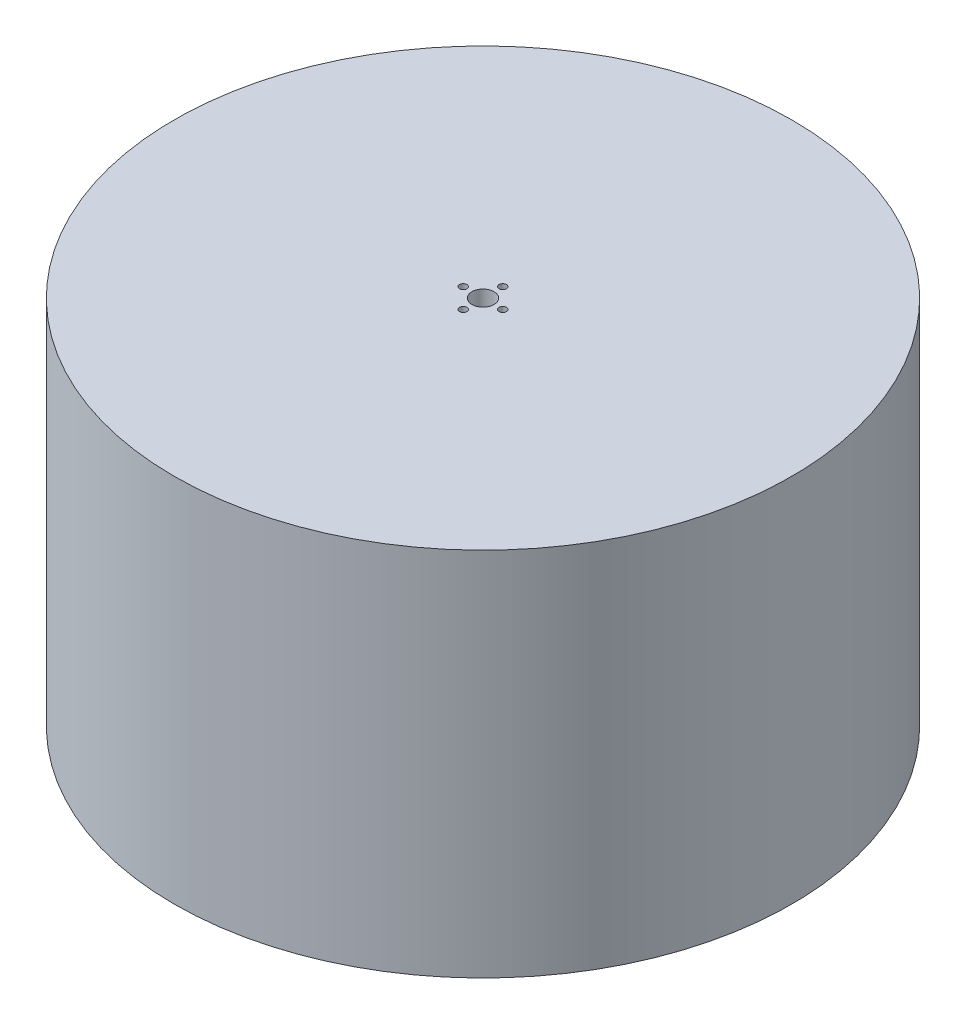
ISO-10303-21;
HEADER;
FILE_DESCRIPTION(('STEP AP214'),'2;1');
FILE_NAME('part.step','',(''),(''),'','','');
FILE_SCHEMA(('AUTOMOTIVE_DESIGN { 1 0 10303 214 1 1 1 1 }'));
ENDSEC;
DATA;
#1=APPLICATION_CONTEXT('core data for automotive mechanical design processes');
#2=APPLICATION_PROTOCOL_DEFINITION('international standard','automotive_design',2000,#1);
#3=PRODUCT_CONTEXT('',#1,'mechanical');
#4=PRODUCT('Part','Part','',(#3));
#5=PRODUCT_RELATED_PRODUCT_CATEGORY('part','',(#4));
#6=PRODUCT_DEFINITION_FORMATION('','',#4);
#7=PRODUCT_DEFINITION_CONTEXT('part definition',#1,'design');
#8=PRODUCT_DEFINITION('design','',#6,#7);
#9=PRODUCT_DEFINITION_SHAPE('','',#8);
#10=(LENGTH_UNIT() NAMED_UNIT(*) SI_UNIT(.MILLI.,.METRE.));
#11=(NAMED_UNIT(*) PLANE_ANGLE_UNIT() SI_UNIT($,.RADIAN.));
#12=(NAMED_UNIT(*) SI_UNIT($,.STERADIAN.) SOLID_ANGLE_UNIT());
#13=UNCERTAINTY_MEASURE_WITH_UNIT(LENGTH_MEASURE(1.E-05),#10,'distance_accuracy_value','');
#14=(GEOMETRIC_REPRESENTATION_CONTEXT(3) GLOBAL_UNCERTAINTY_ASSIGNED_CONTEXT((#13)) GLOBAL_UNIT_ASSIGNED_CONTEXT((#10,
#11,#12)) REPRESENTATION_CONTEXT('',''));
#15=CARTESIAN_POINT('',(0.,0.,0.));
#16=DIRECTION('',(0.,0.,1.));
#17=DIRECTION('',(1.,0.,0.));
#18=AXIS2_PLACEMENT_3D('',#15,#16,#17);
#19=CARTESIAN_POINT('',(0.,150.,0.));
#20=DIRECTION('',(0.,-1.,0.));
#21=DIRECTION('',(0.,0.,-1.));
#22=AXIS2_PLACEMENT_3D('',#19,#20,#21);
#23=CYLINDRICAL_SURFACE('',#22,125.);
#24=CARTESIAN_POINT('',(0.,150.,0.));
#25=DIRECTION('',(0.,1.,0.));
#26=DIRECTION('',(0.,0.,1.));
#27=AXIS2_PLACEMENT_3D('',#24,#25,#26);
#28=CIRCLE('',#27,125.);
#29=CARTESIAN_POINT('',(0.,150.,125.));
#30=VERTEX_POINT('',#29);
#31=EDGE_CURVE('E10',#30,#30,#28,.T.);
#32=ORIENTED_EDGE('',*,*,#31,.F.);
#33=EDGE_LOOP('',(#32));
#34=FACE_BOUND('',#33,.T.);
#35=CARTESIAN_POINT('',(0.,0.,0.));
#36=DIRECTION('',(0.,1.,0.));
#37=DIRECTION('',(0.,0.,1.));
#38=AXIS2_PLACEMENT_3D('',#35,#36,#37);
#39=CIRCLE('',#38,125.);
#40=CARTESIAN_POINT('',(0.,0.,125.));
#41=VERTEX_POINT('',#40);
#42=EDGE_CURVE('E39',#41,#41,#39,.T.);
#43=ORIENTED_EDGE('',*,*,#42,.T.);
#44=EDGE_LOOP('',(#43));
#45=FACE_BOUND('',#44,.T.);
#46=ADVANCED_FACE('F32',(#34,#45),#23,.T.);
#47=CARTESIAN_POINT('',(0.,150.,0.));
#48=DIRECTION('',(0.,1.,0.));
#49=DIRECTION('',(0.,0.,1.));
#50=AXIS2_PLACEMENT_3D('',#47,#48,#49);
#51=PLANE('',#50);
#52=CARTESIAN_POINT('',(-8.,150.,0.));
#53=DIRECTION('',(0.,1.,0.));
#54=DIRECTION('',(0.,0.,1.));
#55=AXIS2_PLACEMENT_3D('',#52,#53,#54);
#56=CIRCLE('',#55,1.5);
#57=CARTESIAN_POINT('',(-8.,150.,1.5));
#58=VERTEX_POINT('',#57);
#59=EDGE_CURVE('E54',#58,#58,#56,.T.);
#60=ORIENTED_EDGE('',*,*,#59,.F.);
#61=EDGE_LOOP('',(#60));
#62=FACE_BOUND('',#61,.T.);
#63=CARTESIAN_POINT('',(0.,150.,8.));
#64=DIRECTION('',(0.,1.,0.));
#65=DIRECTION('',(0.,0.,1.));
#66=AXIS2_PLACEMENT_3D('',#63,#64,#65);
#67=CIRCLE('',#66,1.5);
#68=CARTESIAN_POINT('',(0.,150.,9.5));
#69=VERTEX_POINT('',#68);
#70=EDGE_CURVE('E80',#69,#69,#67,.T.);
#71=ORIENTED_EDGE('',*,*,#70,.F.);
#72=EDGE_LOOP('',(#71));
#73=FACE_BOUND('',#72,.T.);
#74=CARTESIAN_POINT('',(8.,150.,0.));
#75=DIRECTION('',(0.,1.,0.));
#76=DIRECTION('',(0.,0.,1.));
#77=AXIS2_PLACEMENT_3D('',#74,#75,#76);
#78=CIRCLE('',#77,1.50000000000001);
#79=CARTESIAN_POINT('',(8.,150.,1.50000000000001));
#80=VERTEX_POINT('',#79);
#81=EDGE_CURVE('E77',#80,#80,#78,.T.);
#82=ORIENTED_EDGE('',*,*,#81,.F.);
#83=EDGE_LOOP('',(#82));
#84=FACE_BOUND('',#83,.T.);
#85=CARTESIAN_POINT('',(0.,150.,-8.));
#86=DIRECTION('',(0.,1.,0.));
#87=DIRECTION('',(0.,0.,1.));
#88=AXIS2_PLACEMENT_3D('',#85,#86,#87);
#89=CIRCLE('',#88,1.5);
#90=CARTESIAN_POINT('',(0.,150.,-6.5));
#91=VERTEX_POINT('',#90);
#92=EDGE_CURVE('E73',#91,#91,#89,.T.);
#93=ORIENTED_EDGE('',*,*,#92,.F.);
#94=EDGE_LOOP('',(#93));
#95=FACE_BOUND('',#94,.T.);
#96=CARTESIAN_POINT('',(0.,150.,0.));
#97=DIRECTION('',(0.,1.,0.));
#98=DIRECTION('',(0.,0.,1.));
#99=AXIS2_PLACEMENT_3D('',#96,#97,#98);
#100=CIRCLE('',#99,4.5);
#101=CARTESIAN_POINT('',(0.,150.,4.5));
#102=VERTEX_POINT('',#101);
#103=EDGE_CURVE('E76',#102,#102,#100,.T.);
#104=ORIENTED_EDGE('',*,*,#103,.F.);
#105=EDGE_LOOP('',(#104));
#106=FACE_BOUND('',#105,.T.);
#107=ORIENTED_EDGE('',*,*,#31,.T.);
#108=EDGE_LOOP('',(#107));
#109=FACE_BOUND('',#108,.T.);
#110=ADVANCED_FACE('F90',(#62,#73,#84,#95,#106,#109),#51,.T.);
#111=CARTESIAN_POINT('',(0.,0.,0.));
#112=DIRECTION('',(0.,1.,0.));
#113=DIRECTION('',(0.,0.,1.));
#114=AXIS2_PLACEMENT_3D('',#111,#112,#113);
#115=PLANE('',#114);
#116=CARTESIAN_POINT('',(0.,0.,0.));
#117=DIRECTION('',(0.,-1.,0.));
#118=DIRECTION('',(0.,0.,-1.));
#119=AXIS2_PLACEMENT_3D('',#116,#117,#118);
#120=CIRCLE('',#119,121.);
#121=CARTESIAN_POINT('',(0.,0.,-121.));
#122=VERTEX_POINT('',#121);
#123=EDGE_CURVE('E47',#122,#122,#120,.T.);
#124=ORIENTED_EDGE('',*,*,#123,.F.);
#125=EDGE_LOOP('',(#124));
#126=FACE_BOUND('',#125,.T.);
#127=ORIENTED_EDGE('',*,*,#42,.F.);
#128=EDGE_LOOP('',(#127));
#129=FACE_BOUND('',#128,.T.);
#130=ADVANCED_FACE('F93',(#126,#129),#115,.F.);
#131=CARTESIAN_POINT('',(0.,140.,0.));
#132=DIRECTION('',(0.,-1.,0.));
#133=DIRECTION('',(0.,0.,-1.));
#134=AXIS2_PLACEMENT_3D('',#131,#132,#133);
#135=CYLINDRICAL_SURFACE('',#134,121.);
#136=CARTESIAN_POINT('',(0.,140.,0.));
#137=DIRECTION('',(0.,-1.,0.));
#138=DIRECTION('',(0.,0.,-1.));
#139=AXIS2_PLACEMENT_3D('',#136,#137,#138);
#140=CIRCLE('',#139,121.);
#141=CARTESIAN_POINT('',(0.,140.,-121.));
#142=VERTEX_POINT('',#141);
#143=EDGE_CURVE('E44',#142,#142,#140,.T.);
#144=ORIENTED_EDGE('',*,*,#143,.F.);
#145=EDGE_LOOP('',(#144));
#146=FACE_BOUND('',#145,.T.);
#147=ORIENTED_EDGE('',*,*,#123,.T.);
#148=EDGE_LOOP('',(#147));
#149=FACE_BOUND('',#148,.T.);
#150=ADVANCED_FACE('F116',(#146,#149),#135,.F.);
#151=CARTESIAN_POINT('',(0.,140.,0.));
#152=DIRECTION('',(0.,-1.,0.));
#153=DIRECTION('',(0.,0.,-1.));
#154=AXIS2_PLACEMENT_3D('',#151,#152,#153);
#155=PLANE('',#154);
#156=CARTESIAN_POINT('',(-8.,140.,0.));
#157=DIRECTION('',(0.,-1.,0.));
#158=DIRECTION('',(0.,0.,-1.));
#159=AXIS2_PLACEMENT_3D('',#156,#157,#158);
#160=CIRCLE('',#159,1.5);
#161=CARTESIAN_POINT('',(-8.,140.,-1.5));
#162=VERTEX_POINT('',#161);
#163=EDGE_CURVE('E35',#162,#162,#160,.T.);
#164=ORIENTED_EDGE('',*,*,#163,.F.);
#165=EDGE_LOOP('',(#164));
#166=FACE_BOUND('',#165,.T.);
#167=CARTESIAN_POINT('',(0.,140.,8.));
#168=DIRECTION('',(0.,-1.,0.));
#169=DIRECTION('',(0.,0.,-1.));
#170=AXIS2_PLACEMENT_3D('',#167,#168,#169);
#171=CIRCLE('',#170,1.5);
#172=CARTESIAN_POINT('',(0.,140.,6.5));
#173=VERTEX_POINT('',#172);
#174=EDGE_CURVE('E59',#173,#173,#171,.T.);
#175=ORIENTED_EDGE('',*,*,#174,.F.);
#176=EDGE_LOOP('',(#175));
#177=FACE_BOUND('',#176,.T.);
#178=CARTESIAN_POINT('',(8.,140.,0.));
#179=DIRECTION('',(0.,-1.,0.));
#180=DIRECTION('',(0.,0.,-1.));
#181=AXIS2_PLACEMENT_3D('',#178,#179,#180);
#182=CIRCLE('',#181,1.50000000000001);
#183=CARTESIAN_POINT('',(8.,140.,-1.50000000000001));
#184=VERTEX_POINT('',#183);
#185=EDGE_CURVE('E57',#184,#184,#182,.T.);
#186=ORIENTED_EDGE('',*,*,#185,.F.);
#187=EDGE_LOOP('',(#186));
#188=FACE_BOUND('',#187,.T.);
#189=CARTESIAN_POINT('',(0.,140.,-8.));
#190=DIRECTION('',(0.,-1.,0.));
#191=DIRECTION('',(0.,0.,-1.));
#192=AXIS2_PLACEMENT_3D('',#189,#190,#191);
#193=CIRCLE('',#192,1.5);
#194=CARTESIAN_POINT('',(0.,140.,-9.5));
#195=VERTEX_POINT('',#194);
#196=EDGE_CURVE('E53',#195,#195,#193,.T.);
#197=ORIENTED_EDGE('',*,*,#196,.F.);
#198=EDGE_LOOP('',(#197));
#199=FACE_BOUND('',#198,.T.);
#200=CARTESIAN_POINT('',(0.,140.,0.));
#201=DIRECTION('',(0.,-1.,0.));
#202=DIRECTION('',(0.,0.,-1.));
#203=AXIS2_PLACEMENT_3D('',#200,#201,#202);
#204=CIRCLE('',#203,4.5);
#205=CARTESIAN_POINT('',(0.,140.,-4.5));
#206=VERTEX_POINT('',#205);
#207=EDGE_CURVE('E50',#206,#206,#204,.T.);
#208=ORIENTED_EDGE('',*,*,#207,.F.);
#209=EDGE_LOOP('',(#208));
#210=FACE_BOUND('',#209,.T.);
#211=ORIENTED_EDGE('',*,*,#143,.T.);
#212=EDGE_LOOP('',(#211));
#213=FACE_BOUND('',#212,.T.);
#214=ADVANCED_FACE('F106',(#166,#177,#188,#199,#210,#213),#155,.T.);
#215=CARTESIAN_POINT('',(0.,0.,0.));
#216=DIRECTION('',(0.,1.,0.));
#217=DIRECTION('',(0.,0.,1.));
#218=AXIS2_PLACEMENT_3D('',#215,#216,#217);
#219=CYLINDRICAL_SURFACE('',#218,4.5);
#220=ORIENTED_EDGE('',*,*,#207,.T.);
#221=EDGE_LOOP('',(#220));
#222=FACE_BOUND('',#221,.T.);
#223=ORIENTED_EDGE('',*,*,#103,.T.);
#224=EDGE_LOOP('',(#223));
#225=FACE_BOUND('',#224,.T.);
#226=ADVANCED_FACE('F103',(#222,#225),#219,.F.);
#227=CARTESIAN_POINT('',(0.,0.,-8.));
#228=DIRECTION('',(0.,1.,0.));
#229=DIRECTION('',(0.,0.,1.));
#230=AXIS2_PLACEMENT_3D('',#227,#228,#229);
#231=CYLINDRICAL_SURFACE('',#230,1.5);
#232=ORIENTED_EDGE('',*,*,#196,.T.);
#233=EDGE_LOOP('',(#232));
#234=FACE_BOUND('',#233,.T.);
#235=ORIENTED_EDGE('',*,*,#92,.T.);
#236=EDGE_LOOP('',(#235));
#237=FACE_BOUND('',#236,.T.);
#238=ADVANCED_FACE('F105',(#234,#237),#231,.F.);
#239=CARTESIAN_POINT('',(8.,0.,0.));
#240=DIRECTION('',(0.,1.,0.));
#241=DIRECTION('',(0.,0.,1.));
#242=AXIS2_PLACEMENT_3D('',#239,#240,#241);
#243=CYLINDRICAL_SURFACE('',#242,1.50000000000001);
#244=ORIENTED_EDGE('',*,*,#185,.T.);
#245=EDGE_LOOP('',(#244));
#246=FACE_BOUND('',#245,.T.);
#247=ORIENTED_EDGE('',*,*,#81,.T.);
#248=EDGE_LOOP('',(#247));
#249=FACE_BOUND('',#248,.T.);
#250=ADVANCED_FACE('F113',(#246,#249),#243,.F.);
#251=CARTESIAN_POINT('',(0.,0.,8.));
#252=DIRECTION('',(0.,1.,0.));
#253=DIRECTION('',(0.,0.,1.));
#254=AXIS2_PLACEMENT_3D('',#251,#252,#253);
#255=CYLINDRICAL_SURFACE('',#254,1.5);
#256=ORIENTED_EDGE('',*,*,#174,.T.);
#257=EDGE_LOOP('',(#256));
#258=FACE_BOUND('',#257,.T.);
#259=ORIENTED_EDGE('',*,*,#70,.T.);
#260=EDGE_LOOP('',(#259));
#261=FACE_BOUND('',#260,.T.);
#262=ADVANCED_FACE('F162',(#258,#261),#255,.F.);
#263=CARTESIAN_POINT('',(-8.,0.,0.));
#264=DIRECTION('',(0.,1.,0.));
#265=DIRECTION('',(0.,0.,1.));
#266=AXIS2_PLACEMENT_3D('',#263,#264,#265);
#267=CYLINDRICAL_SURFACE('',#266,1.5);
#268=ORIENTED_EDGE('',*,*,#163,.T.);
#269=EDGE_LOOP('',(#268));
#270=FACE_BOUND('',#269,.T.);
#271=ORIENTED_EDGE('',*,*,#59,.T.);
#272=EDGE_LOOP('',(#271));
#273=FACE_BOUND('',#272,.T.);
#274=ADVANCED_FACE('F88',(#270,#273),#267,.F.);
#275=CLOSED_SHELL('',(#46,#110,#130,#150,#214,#226,#238,#250,#262,#274));
#276=MANIFOLD_SOLID_BREP('B2',#275);
#277=ADVANCED_BREP_SHAPE_REPRESENTATION('',(#18,#276),#14);
#278=SHAPE_DEFINITION_REPRESENTATION(#9,#277);
ENDSEC;
END-ISO-10303-21;
